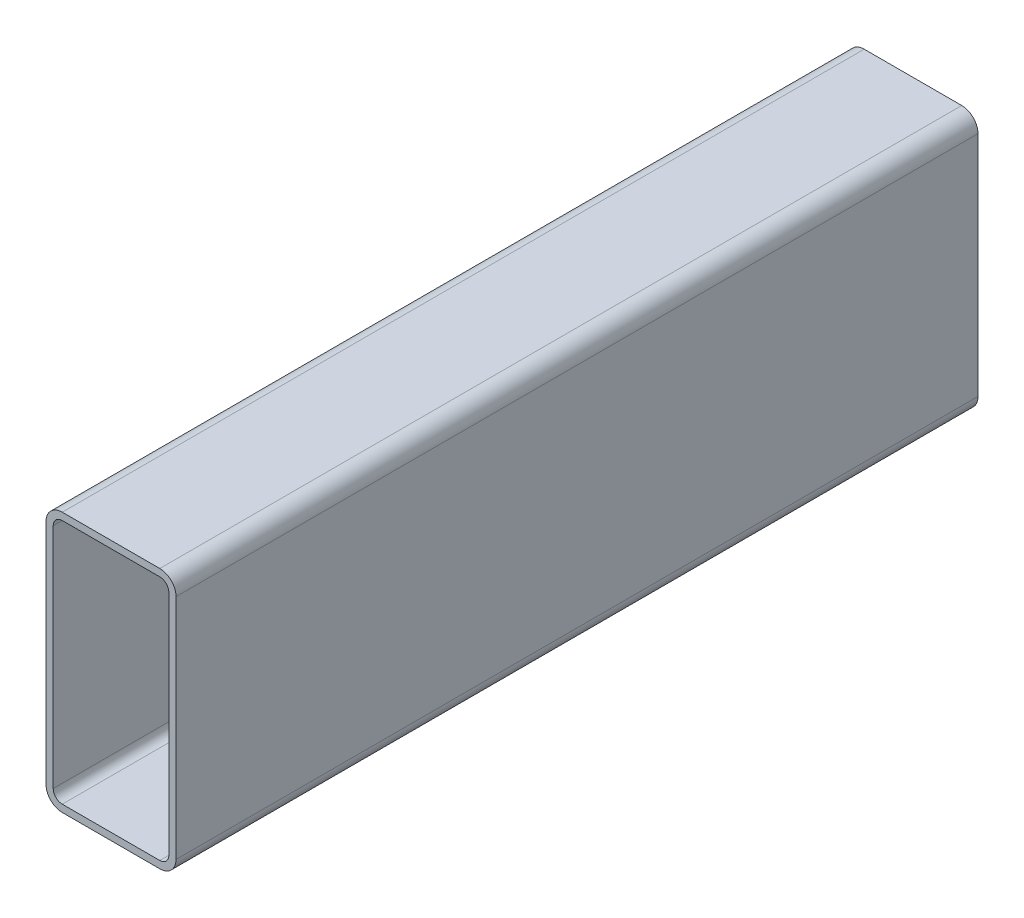
ISO-10303-21;
HEADER;
FILE_DESCRIPTION(('STEP AP214'),'2;1');
FILE_NAME('part.step','',(''),(''),'','','');
FILE_SCHEMA(('AUTOMOTIVE_DESIGN { 1 0 10303 214 1 1 1 1 }'));
ENDSEC;
DATA;
#1=APPLICATION_CONTEXT('core data for automotive mechanical design processes');
#2=APPLICATION_PROTOCOL_DEFINITION('international standard','automotive_design',2000,#1);
#3=PRODUCT_CONTEXT('',#1,'mechanical');
#4=PRODUCT('Part','Part','',(#3));
#5=PRODUCT_RELATED_PRODUCT_CATEGORY('part','',(#4));
#6=PRODUCT_DEFINITION_FORMATION('','',#4);
#7=PRODUCT_DEFINITION_CONTEXT('part definition',#1,'design');
#8=PRODUCT_DEFINITION('design','',#6,#7);
#9=PRODUCT_DEFINITION_SHAPE('','',#8);
#10=(LENGTH_UNIT() NAMED_UNIT(*) SI_UNIT(.MILLI.,.METRE.));
#11=(NAMED_UNIT(*) PLANE_ANGLE_UNIT() SI_UNIT($,.RADIAN.));
#12=(NAMED_UNIT(*) SI_UNIT($,.STERADIAN.) SOLID_ANGLE_UNIT());
#13=UNCERTAINTY_MEASURE_WITH_UNIT(LENGTH_MEASURE(1.E-05),#10,'distance_accuracy_value','');
#14=(GEOMETRIC_REPRESENTATION_CONTEXT(3) GLOBAL_UNCERTAINTY_ASSIGNED_CONTEXT((#13)) GLOBAL_UNIT_ASSIGNED_CONTEXT((#10,
#11,#12)) REPRESENTATION_CONTEXT('',''));
#15=CARTESIAN_POINT('',(0.,0.,0.));
#16=DIRECTION('',(0.,0.,1.));
#17=DIRECTION('',(1.,0.,0.));
#18=AXIS2_PLACEMENT_3D('',#15,#16,#17);
#19=CARTESIAN_POINT('',(14.2874999999999,33.3375,234.95));
#20=DIRECTION('',(0.,0.,-1.));
#21=DIRECTION('',(0.,1.,0.));
#22=AXIS2_PLACEMENT_3D('',#19,#20,#21);
#23=CYLINDRICAL_SURFACE('',#22,4.7625);
#24=CARTESIAN_POINT('',(14.2874999999999,33.3375,0.));
#25=DIRECTION('',(0.,0.,1.));
#26=DIRECTION('',(1.,0.,0.));
#27=AXIS2_PLACEMENT_3D('',#24,#25,#26);
#28=CIRCLE('',#27,4.7625);
#29=CARTESIAN_POINT('',(19.0499999999999,33.3375000000001,0.));
#30=VERTEX_POINT('',#29);
#31=CARTESIAN_POINT('',(14.2874999999999,38.1000000000001,0.));
#32=VERTEX_POINT('',#31);
#33=EDGE_CURVE('E235',#30,#32,#28,.T.);
#34=ORIENTED_EDGE('',*,*,#33,.T.);
#35=DIRECTION('',(0.,0.,-1.));
#36=VECTOR('',#35,1.);
#37=CARTESIAN_POINT('',(14.2874999999999,38.1,234.95));
#38=LINE('',#37,#36);
#39=CARTESIAN_POINT('',(14.2874999999999,38.1,234.95));
#40=VERTEX_POINT('',#39);
#41=EDGE_CURVE('E12',#40,#32,#38,.T.);
#42=ORIENTED_EDGE('',*,*,#41,.F.);
#43=CARTESIAN_POINT('',(14.2874999999999,33.3375,234.95));
#44=DIRECTION('',(0.,0.,1.));
#45=DIRECTION('',(1.,0.,0.));
#46=AXIS2_PLACEMENT_3D('',#43,#44,#45);
#47=CIRCLE('',#46,4.7625);
#48=CARTESIAN_POINT('',(19.0499999999999,33.3375,234.95));
#49=VERTEX_POINT('',#48);
#50=EDGE_CURVE('E313',#49,#40,#47,.T.);
#51=ORIENTED_EDGE('',*,*,#50,.F.);
#52=DIRECTION('',(0.,0.,-1.));
#53=VECTOR('',#52,1.);
#54=CARTESIAN_POINT('',(19.0499999999999,33.3375,234.95));
#55=LINE('',#54,#53);
#56=EDGE_CURVE('E250',#49,#30,#55,.T.);
#57=ORIENTED_EDGE('',*,*,#56,.T.);
#58=EDGE_LOOP('',(#34,#42,#51,#57));
#59=FACE_BOUND('',#58,.T.);
#60=ADVANCED_FACE('F63',(#59),#23,.T.);
#61=CARTESIAN_POINT('',(14.2874999999999,38.1,234.95));
#62=DIRECTION('',(0.,-1.,0.));
#63=DIRECTION('',(1.,0.,0.));
#64=AXIS2_PLACEMENT_3D('',#61,#62,#63);
#65=PLANE('',#64);
#66=DIRECTION('',(-1.,0.,0.));
#67=VECTOR('',#66,1.);
#68=CARTESIAN_POINT('',(14.2874999999999,38.1000000000001,0.));
#69=LINE('',#68,#67);
#70=CARTESIAN_POINT('',(-14.2875000000001,38.1,0.));
#71=VERTEX_POINT('',#70);
#72=EDGE_CURVE('E238',#32,#71,#69,.T.);
#73=ORIENTED_EDGE('',*,*,#72,.T.);
#74=DIRECTION('',(0.,0.,-1.));
#75=VECTOR('',#74,1.);
#76=CARTESIAN_POINT('',(-14.2875000000001,38.0999999999999,234.95));
#77=LINE('',#76,#75);
#78=CARTESIAN_POINT('',(-14.2875000000001,38.0999999999999,234.95));
#79=VERTEX_POINT('',#78);
#80=EDGE_CURVE('E73',#79,#71,#77,.T.);
#81=ORIENTED_EDGE('',*,*,#80,.F.);
#82=DIRECTION('',(-1.,0.,0.));
#83=VECTOR('',#82,1.);
#84=CARTESIAN_POINT('',(14.2874999999999,38.1,234.95));
#85=LINE('',#84,#83);
#86=EDGE_CURVE('E315',#40,#79,#85,.T.);
#87=ORIENTED_EDGE('',*,*,#86,.F.);
#88=ORIENTED_EDGE('',*,*,#41,.T.);
#89=EDGE_LOOP('',(#73,#81,#87,#88));
#90=FACE_BOUND('',#89,.T.);
#91=ADVANCED_FACE('F350',(#90),#65,.F.);
#92=CARTESIAN_POINT('',(-14.2875000000001,33.3374999999999,234.95));
#93=DIRECTION('',(0.,0.,-1.));
#94=DIRECTION('',(0.,1.,0.));
#95=AXIS2_PLACEMENT_3D('',#92,#93,#94);
#96=CYLINDRICAL_SURFACE('',#95,4.7625);
#97=CARTESIAN_POINT('',(-14.2875000000001,33.3374999999999,0.));
#98=DIRECTION('',(0.,0.,1.));
#99=DIRECTION('',(1.,0.,0.));
#100=AXIS2_PLACEMENT_3D('',#97,#98,#99);
#101=CIRCLE('',#100,4.7625);
#102=CARTESIAN_POINT('',(-19.0500000000001,33.3374999999999,0.));
#103=VERTEX_POINT('',#102);
#104=EDGE_CURVE('E240',#71,#103,#101,.T.);
#105=ORIENTED_EDGE('',*,*,#104,.T.);
#106=DIRECTION('',(0.,0.,-1.));
#107=VECTOR('',#106,1.);
#108=CARTESIAN_POINT('',(-19.0500000000001,33.3374999999999,234.95));
#109=LINE('',#108,#107);
#110=CARTESIAN_POINT('',(-19.0500000000001,33.3374999999999,234.95));
#111=VERTEX_POINT('',#110);
#112=EDGE_CURVE('E257',#111,#103,#109,.T.);
#113=ORIENTED_EDGE('',*,*,#112,.F.);
#114=CARTESIAN_POINT('',(-14.2875000000001,33.3374999999999,234.95));
#115=DIRECTION('',(0.,0.,1.));
#116=DIRECTION('',(1.,0.,0.));
#117=AXIS2_PLACEMENT_3D('',#114,#115,#116);
#118=CIRCLE('',#117,4.7625);
#119=EDGE_CURVE('E317',#79,#111,#118,.T.);
#120=ORIENTED_EDGE('',*,*,#119,.F.);
#121=ORIENTED_EDGE('',*,*,#80,.T.);
#122=EDGE_LOOP('',(#105,#113,#120,#121));
#123=FACE_BOUND('',#122,.T.);
#124=ADVANCED_FACE('F355',(#123),#96,.T.);
#125=CARTESIAN_POINT('',(-19.0499999999999,-33.3375000000001,234.95));
#126=DIRECTION('',(1.,0.,0.));
#127=DIRECTION('',(0.,1.,0.));
#128=AXIS2_PLACEMENT_3D('',#125,#126,#127);
#129=PLANE('',#128);
#130=DIRECTION('',(0.,-1.,0.));
#131=VECTOR('',#130,1.);
#132=CARTESIAN_POINT('',(-19.0499999999999,-33.3375000000001,0.));
#133=LINE('',#132,#131);
#134=CARTESIAN_POINT('',(-19.0499999999999,-33.3375000000001,0.));
#135=VERTEX_POINT('',#134);
#136=EDGE_CURVE('E242',#103,#135,#133,.T.);
#137=ORIENTED_EDGE('',*,*,#136,.T.);
#138=DIRECTION('',(0.,0.,-1.));
#139=VECTOR('',#138,1.);
#140=CARTESIAN_POINT('',(-19.0499999999999,-33.3375000000001,234.95));
#141=LINE('',#140,#139);
#142=CARTESIAN_POINT('',(-19.0499999999999,-33.3375000000001,234.95));
#143=VERTEX_POINT('',#142);
#144=EDGE_CURVE('E254',#143,#135,#141,.T.);
#145=ORIENTED_EDGE('',*,*,#144,.F.);
#146=DIRECTION('',(0.,-1.,0.));
#147=VECTOR('',#146,1.);
#148=CARTESIAN_POINT('',(-19.0499999999999,-33.3375000000001,234.95));
#149=LINE('',#148,#147);
#150=EDGE_CURVE('E319',#111,#143,#149,.T.);
#151=ORIENTED_EDGE('',*,*,#150,.F.);
#152=ORIENTED_EDGE('',*,*,#112,.T.);
#153=EDGE_LOOP('',(#137,#145,#151,#152));
#154=FACE_BOUND('',#153,.T.);
#155=ADVANCED_FACE('F325',(#154),#129,.F.);
#156=CARTESIAN_POINT('',(-14.2874999999999,-33.3375000000001,234.95));
#157=DIRECTION('',(0.,0.,-1.));
#158=DIRECTION('',(0.,1.,0.));
#159=AXIS2_PLACEMENT_3D('',#156,#157,#158);
#160=CYLINDRICAL_SURFACE('',#159,4.7625);
#161=CARTESIAN_POINT('',(-14.2874999999999,-33.3375,0.));
#162=DIRECTION('',(0.,0.,1.));
#163=DIRECTION('',(1.,0.,0.));
#164=AXIS2_PLACEMENT_3D('',#161,#162,#163);
#165=CIRCLE('',#164,4.7625);
#166=CARTESIAN_POINT('',(-14.2874999999999,-38.1000000000001,0.));
#167=VERTEX_POINT('',#166);
#168=EDGE_CURVE('E244',#135,#167,#165,.T.);
#169=ORIENTED_EDGE('',*,*,#168,.T.);
#170=DIRECTION('',(0.,0.,-1.));
#171=VECTOR('',#170,1.);
#172=CARTESIAN_POINT('',(-14.2874999999999,-38.1000000000001,234.95));
#173=LINE('',#172,#171);
#174=CARTESIAN_POINT('',(-14.2874999999999,-38.1000000000001,234.95));
#175=VERTEX_POINT('',#174);
#176=EDGE_CURVE('E202',#175,#167,#173,.T.);
#177=ORIENTED_EDGE('',*,*,#176,.F.);
#178=CARTESIAN_POINT('',(-14.2874999999999,-33.3375000000001,234.95));
#179=DIRECTION('',(0.,0.,1.));
#180=DIRECTION('',(1.,0.,0.));
#181=AXIS2_PLACEMENT_3D('',#178,#179,#180);
#182=CIRCLE('',#181,4.7625);
#183=EDGE_CURVE('E193',#143,#175,#182,.T.);
#184=ORIENTED_EDGE('',*,*,#183,.F.);
#185=ORIENTED_EDGE('',*,*,#144,.T.);
#186=EDGE_LOOP('',(#169,#177,#184,#185));
#187=FACE_BOUND('',#186,.T.);
#188=ADVANCED_FACE('F329',(#187),#160,.T.);
#189=CARTESIAN_POINT('',(-14.2874999999999,-38.1000000000001,234.95));
#190=DIRECTION('',(0.,1.,0.));
#191=DIRECTION('',(-1.,0.,0.));
#192=AXIS2_PLACEMENT_3D('',#189,#190,#191);
#193=PLANE('',#192);
#194=DIRECTION('',(1.,0.,0.));
#195=VECTOR('',#194,1.);
#196=CARTESIAN_POINT('',(-14.2874999999999,-38.1000000000001,0.));
#197=LINE('',#196,#195);
#198=CARTESIAN_POINT('',(14.2875000000001,-38.1,0.));
#199=VERTEX_POINT('',#198);
#200=EDGE_CURVE('E201',#167,#199,#197,.T.);
#201=ORIENTED_EDGE('',*,*,#200,.T.);
#202=DIRECTION('',(0.,0.,-1.));
#203=VECTOR('',#202,1.);
#204=CARTESIAN_POINT('',(14.2875000000001,-38.1,234.95));
#205=LINE('',#204,#203);
#206=CARTESIAN_POINT('',(14.2875000000001,-38.1,234.95));
#207=VERTEX_POINT('',#206);
#208=EDGE_CURVE('E198',#207,#199,#205,.T.);
#209=ORIENTED_EDGE('',*,*,#208,.F.);
#210=DIRECTION('',(1.,0.,0.));
#211=VECTOR('',#210,1.);
#212=CARTESIAN_POINT('',(-14.2874999999999,-38.1000000000001,234.95));
#213=LINE('',#212,#211);
#214=EDGE_CURVE('E187',#175,#207,#213,.T.);
#215=ORIENTED_EDGE('',*,*,#214,.F.);
#216=ORIENTED_EDGE('',*,*,#176,.T.);
#217=EDGE_LOOP('',(#201,#209,#215,#216));
#218=FACE_BOUND('',#217,.T.);
#219=ADVANCED_FACE('F199',(#218),#193,.F.);
#220=CARTESIAN_POINT('',(14.2875000000001,-33.3375,234.95));
#221=DIRECTION('',(0.,0.,-1.));
#222=DIRECTION('',(0.,1.,0.));
#223=AXIS2_PLACEMENT_3D('',#220,#221,#222);
#224=CYLINDRICAL_SURFACE('',#223,4.7625);
#225=CARTESIAN_POINT('',(14.2875000000001,-33.3374999999999,0.));
#226=DIRECTION('',(0.,0.,1.));
#227=DIRECTION('',(1.,0.,0.));
#228=AXIS2_PLACEMENT_3D('',#225,#226,#227);
#229=CIRCLE('',#228,4.7625);
#230=CARTESIAN_POINT('',(19.0500000000001,-33.3374999999999,0.));
#231=VERTEX_POINT('',#230);
#232=EDGE_CURVE('E135',#199,#231,#229,.T.);
#233=ORIENTED_EDGE('',*,*,#232,.T.);
#234=DIRECTION('',(0.,0.,-1.));
#235=VECTOR('',#234,1.);
#236=CARTESIAN_POINT('',(19.0500000000001,-33.3375,234.95));
#237=LINE('',#236,#235);
#238=CARTESIAN_POINT('',(19.0500000000001,-33.3375,234.95));
#239=VERTEX_POINT('',#238);
#240=EDGE_CURVE('E203',#239,#231,#237,.T.);
#241=ORIENTED_EDGE('',*,*,#240,.F.);
#242=CARTESIAN_POINT('',(14.2875000000001,-33.3375,234.95));
#243=DIRECTION('',(0.,0.,1.));
#244=DIRECTION('',(1.,0.,0.));
#245=AXIS2_PLACEMENT_3D('',#242,#243,#244);
#246=CIRCLE('',#245,4.7625);
#247=EDGE_CURVE('E191',#207,#239,#246,.T.);
#248=ORIENTED_EDGE('',*,*,#247,.F.);
#249=ORIENTED_EDGE('',*,*,#208,.T.);
#250=EDGE_LOOP('',(#233,#241,#248,#249));
#251=FACE_BOUND('',#250,.T.);
#252=ADVANCED_FACE('F205',(#251),#224,.T.);
#253=CARTESIAN_POINT('',(-14.2875000000001,33.3374999999999,234.95));
#254=DIRECTION('',(0.,0.,-1.));
#255=DIRECTION('',(0.,1.,0.));
#256=AXIS2_PLACEMENT_3D('',#253,#254,#255);
#257=CYLINDRICAL_SURFACE('',#256,2.64668);
#258=CARTESIAN_POINT('',(-14.2875000000001,33.3374999999999,0.));
#259=DIRECTION('',(0.,0.,1.));
#260=DIRECTION('',(1.,0.,0.));
#261=AXIS2_PLACEMENT_3D('',#258,#259,#260);
#262=CIRCLE('',#261,2.64668);
#263=CARTESIAN_POINT('',(-14.2875000000001,35.98418,0.));
#264=VERTEX_POINT('',#263);
#265=CARTESIAN_POINT('',(-16.9341800000001,33.3374999999999,0.));
#266=VERTEX_POINT('',#265);
#267=EDGE_CURVE('E211',#264,#266,#262,.T.);
#268=ORIENTED_EDGE('',*,*,#267,.F.);
#269=DIRECTION('',(0.,0.,-1.));
#270=VECTOR('',#269,1.);
#271=CARTESIAN_POINT('',(-14.2875000000001,35.9841799999999,234.95));
#272=LINE('',#271,#270);
#273=CARTESIAN_POINT('',(-14.2875000000001,35.9841799999999,234.95));
#274=VERTEX_POINT('',#273);
#275=EDGE_CURVE('E67',#274,#264,#272,.T.);
#276=ORIENTED_EDGE('',*,*,#275,.F.);
#277=CARTESIAN_POINT('',(-14.2875000000001,33.3374999999999,234.95));
#278=DIRECTION('',(0.,0.,1.));
#279=DIRECTION('',(1.,0.,0.));
#280=AXIS2_PLACEMENT_3D('',#277,#278,#279);
#281=CIRCLE('',#280,2.64668);
#282=CARTESIAN_POINT('',(-16.9341800000001,33.3374999999999,234.95));
#283=VERTEX_POINT('',#282);
#284=EDGE_CURVE('E249',#274,#283,#281,.T.);
#285=ORIENTED_EDGE('',*,*,#284,.T.);
#286=DIRECTION('',(0.,0.,-1.));
#287=VECTOR('',#286,1.);
#288=CARTESIAN_POINT('',(-16.9341800000001,33.3374999999999,234.95));
#289=LINE('',#288,#287);
#290=EDGE_CURVE('E207',#283,#266,#289,.T.);
#291=ORIENTED_EDGE('',*,*,#290,.T.);
#292=EDGE_LOOP('',(#268,#276,#285,#291));
#293=FACE_BOUND('',#292,.T.);
#294=ADVANCED_FACE('F65',(#293),#257,.F.);
#295=CARTESIAN_POINT('',(14.2874999999999,35.98418,234.95));
#296=DIRECTION('',(0.,-1.,0.));
#297=DIRECTION('',(1.,0.,0.));
#298=AXIS2_PLACEMENT_3D('',#295,#296,#297);
#299=PLANE('',#298);
#300=DIRECTION('',(-1.,0.,0.));
#301=VECTOR('',#300,1.);
#302=CARTESIAN_POINT('',(14.2874999999999,35.98418,0.));
#303=LINE('',#302,#301);
#304=CARTESIAN_POINT('',(14.2874999999999,35.98418,0.));
#305=VERTEX_POINT('',#304);
#306=EDGE_CURVE('E214',#305,#264,#303,.T.);
#307=ORIENTED_EDGE('',*,*,#306,.F.);
#308=DIRECTION('',(0.,0.,-1.));
#309=VECTOR('',#308,1.);
#310=CARTESIAN_POINT('',(14.2874999999999,35.98418,234.95));
#311=LINE('',#310,#309);
#312=CARTESIAN_POINT('',(14.2874999999999,35.98418,234.95));
#313=VERTEX_POINT('',#312);
#314=EDGE_CURVE('E272',#313,#305,#311,.T.);
#315=ORIENTED_EDGE('',*,*,#314,.F.);
#316=DIRECTION('',(-1.,0.,0.));
#317=VECTOR('',#316,1.);
#318=CARTESIAN_POINT('',(14.2874999999999,35.98418,234.95));
#319=LINE('',#318,#317);
#320=EDGE_CURVE('E281',#313,#274,#319,.T.);
#321=ORIENTED_EDGE('',*,*,#320,.T.);
#322=ORIENTED_EDGE('',*,*,#275,.T.);
#323=EDGE_LOOP('',(#307,#315,#321,#322));
#324=FACE_BOUND('',#323,.T.);
#325=ADVANCED_FACE('F279',(#324),#299,.T.);
#326=CARTESIAN_POINT('',(14.2874999999999,33.3375,234.95));
#327=DIRECTION('',(0.,0.,-1.));
#328=DIRECTION('',(0.,1.,0.));
#329=AXIS2_PLACEMENT_3D('',#326,#327,#328);
#330=CYLINDRICAL_SURFACE('',#329,2.64668);
#331=CARTESIAN_POINT('',(14.2874999999999,33.3375,0.));
#332=DIRECTION('',(0.,0.,1.));
#333=DIRECTION('',(1.,0.,0.));
#334=AXIS2_PLACEMENT_3D('',#331,#332,#333);
#335=CIRCLE('',#334,2.64668);
#336=CARTESIAN_POINT('',(16.9341799999999,33.3375000000001,0.));
#337=VERTEX_POINT('',#336);
#338=EDGE_CURVE('E217',#337,#305,#335,.T.);
#339=ORIENTED_EDGE('',*,*,#338,.F.);
#340=DIRECTION('',(0.,0.,-1.));
#341=VECTOR('',#340,1.);
#342=CARTESIAN_POINT('',(16.9341799999999,33.3375,234.95));
#343=LINE('',#342,#341);
#344=CARTESIAN_POINT('',(16.9341799999999,33.3375,234.95));
#345=VERTEX_POINT('',#344);
#346=EDGE_CURVE('E271',#345,#337,#343,.T.);
#347=ORIENTED_EDGE('',*,*,#346,.F.);
#348=CARTESIAN_POINT('',(14.2874999999999,33.3375,234.95));
#349=DIRECTION('',(0.,0.,1.));
#350=DIRECTION('',(1.,0.,0.));
#351=AXIS2_PLACEMENT_3D('',#348,#349,#350);
#352=CIRCLE('',#351,2.64668);
#353=EDGE_CURVE('E289',#345,#313,#352,.T.);
#354=ORIENTED_EDGE('',*,*,#353,.T.);
#355=ORIENTED_EDGE('',*,*,#314,.T.);
#356=EDGE_LOOP('',(#339,#347,#354,#355));
#357=FACE_BOUND('',#356,.T.);
#358=ADVANCED_FACE('F287',(#357),#330,.F.);
#359=CARTESIAN_POINT('',(16.9341799999999,33.3375,234.95));
#360=DIRECTION('',(-1.,0.,0.));
#361=DIRECTION('',(0.,-1.,0.));
#362=AXIS2_PLACEMENT_3D('',#359,#360,#361);
#363=PLANE('',#362);
#364=DIRECTION('',(0.,1.,0.));
#365=VECTOR('',#364,1.);
#366=CARTESIAN_POINT('',(16.9341799999999,33.3375000000001,0.));
#367=LINE('',#366,#365);
#368=CARTESIAN_POINT('',(16.9341800000001,-33.3374999999999,0.));
#369=VERTEX_POINT('',#368);
#370=EDGE_CURVE('E220',#369,#337,#367,.T.);
#371=ORIENTED_EDGE('',*,*,#370,.F.);
#372=DIRECTION('',(0.,0.,-1.));
#373=VECTOR('',#372,1.);
#374=CARTESIAN_POINT('',(16.9341800000001,-33.3375,234.95));
#375=LINE('',#374,#373);
#376=CARTESIAN_POINT('',(16.9341800000001,-33.3375,234.95));
#377=VERTEX_POINT('',#376);
#378=EDGE_CURVE('E269',#377,#369,#375,.T.);
#379=ORIENTED_EDGE('',*,*,#378,.F.);
#380=DIRECTION('',(0.,1.,0.));
#381=VECTOR('',#380,1.);
#382=CARTESIAN_POINT('',(16.9341799999999,33.3375,234.95));
#383=LINE('',#382,#381);
#384=EDGE_CURVE('E295',#377,#345,#383,.T.);
#385=ORIENTED_EDGE('',*,*,#384,.T.);
#386=ORIENTED_EDGE('',*,*,#346,.T.);
#387=EDGE_LOOP('',(#371,#379,#385,#386));
#388=FACE_BOUND('',#387,.T.);
#389=ADVANCED_FACE('F298',(#388),#363,.T.);
#390=CARTESIAN_POINT('',(14.2875000000001,-33.3375,234.95));
#391=DIRECTION('',(0.,0.,-1.));
#392=DIRECTION('',(0.,1.,0.));
#393=AXIS2_PLACEMENT_3D('',#390,#391,#392);
#394=CYLINDRICAL_SURFACE('',#393,2.64668);
#395=CARTESIAN_POINT('',(14.2875000000001,-33.3374999999999,0.));
#396=DIRECTION('',(0.,0.,1.));
#397=DIRECTION('',(1.,0.,0.));
#398=AXIS2_PLACEMENT_3D('',#395,#396,#397);
#399=CIRCLE('',#398,2.64668);
#400=CARTESIAN_POINT('',(14.2875000000001,-35.98418,0.));
#401=VERTEX_POINT('',#400);
#402=EDGE_CURVE('E223',#401,#369,#399,.T.);
#403=ORIENTED_EDGE('',*,*,#402,.F.);
#404=DIRECTION('',(0.,0.,-1.));
#405=VECTOR('',#404,1.);
#406=CARTESIAN_POINT('',(14.2875000000001,-35.98418,234.95));
#407=LINE('',#406,#405);
#408=CARTESIAN_POINT('',(14.2875000000001,-35.98418,234.95));
#409=VERTEX_POINT('',#408);
#410=EDGE_CURVE('E267',#409,#401,#407,.T.);
#411=ORIENTED_EDGE('',*,*,#410,.F.);
#412=CARTESIAN_POINT('',(14.2875000000001,-33.3375,234.95));
#413=DIRECTION('',(0.,0.,1.));
#414=DIRECTION('',(1.,0.,0.));
#415=AXIS2_PLACEMENT_3D('',#412,#413,#414);
#416=CIRCLE('',#415,2.64668);
#417=EDGE_CURVE('E299',#409,#377,#416,.T.);
#418=ORIENTED_EDGE('',*,*,#417,.T.);
#419=ORIENTED_EDGE('',*,*,#378,.T.);
#420=EDGE_LOOP('',(#403,#411,#418,#419));
#421=FACE_BOUND('',#420,.T.);
#422=ADVANCED_FACE('F366',(#421),#394,.F.);
#423=CARTESIAN_POINT('',(-14.2874999999999,-35.9841800000001,234.95));
#424=DIRECTION('',(0.,1.,0.));
#425=DIRECTION('',(-1.,0.,0.));
#426=AXIS2_PLACEMENT_3D('',#423,#424,#425);
#427=PLANE('',#426);
#428=DIRECTION('',(1.,0.,0.));
#429=VECTOR('',#428,1.);
#430=CARTESIAN_POINT('',(-14.2874999999999,-35.98418,0.));
#431=LINE('',#430,#429);
#432=CARTESIAN_POINT('',(-14.2874999999999,-35.98418,0.));
#433=VERTEX_POINT('',#432);
#434=EDGE_CURVE('E226',#433,#401,#431,.T.);
#435=ORIENTED_EDGE('',*,*,#434,.F.);
#436=DIRECTION('',(0.,0.,-1.));
#437=VECTOR('',#436,1.);
#438=CARTESIAN_POINT('',(-14.2874999999999,-35.9841800000001,234.95));
#439=LINE('',#438,#437);
#440=CARTESIAN_POINT('',(-14.2874999999999,-35.9841800000001,234.95));
#441=VERTEX_POINT('',#440);
#442=EDGE_CURVE('E265',#441,#433,#439,.T.);
#443=ORIENTED_EDGE('',*,*,#442,.F.);
#444=DIRECTION('',(1.,0.,0.));
#445=VECTOR('',#444,1.);
#446=CARTESIAN_POINT('',(-14.2874999999999,-35.9841800000001,234.95));
#447=LINE('',#446,#445);
#448=EDGE_CURVE('E301',#441,#409,#447,.T.);
#449=ORIENTED_EDGE('',*,*,#448,.T.);
#450=ORIENTED_EDGE('',*,*,#410,.T.);
#451=EDGE_LOOP('',(#435,#443,#449,#450));
#452=FACE_BOUND('',#451,.T.);
#453=ADVANCED_FACE('F362',(#452),#427,.T.);
#454=CARTESIAN_POINT('',(-14.2874999999999,-33.3375000000001,234.95));
#455=DIRECTION('',(0.,0.,-1.));
#456=DIRECTION('',(0.,1.,0.));
#457=AXIS2_PLACEMENT_3D('',#454,#455,#456);
#458=CYLINDRICAL_SURFACE('',#457,2.64668);
#459=CARTESIAN_POINT('',(-14.2874999999999,-33.3375,0.));
#460=DIRECTION('',(0.,0.,1.));
#461=DIRECTION('',(1.,0.,0.));
#462=AXIS2_PLACEMENT_3D('',#459,#460,#461);
#463=CIRCLE('',#462,2.64668);
#464=CARTESIAN_POINT('',(-16.9341799999999,-33.3375000000001,0.));
#465=VERTEX_POINT('',#464);
#466=EDGE_CURVE('E229',#465,#433,#463,.T.);
#467=ORIENTED_EDGE('',*,*,#466,.F.);
#468=DIRECTION('',(0.,0.,-1.));
#469=VECTOR('',#468,1.);
#470=CARTESIAN_POINT('',(-16.9341799999999,-33.3375000000001,234.95));
#471=LINE('',#470,#469);
#472=CARTESIAN_POINT('',(-16.9341799999999,-33.3375000000001,234.95));
#473=VERTEX_POINT('',#472);
#474=EDGE_CURVE('E263',#473,#465,#471,.T.);
#475=ORIENTED_EDGE('',*,*,#474,.F.);
#476=CARTESIAN_POINT('',(-14.2874999999999,-33.3375000000001,234.95));
#477=DIRECTION('',(0.,0.,1.));
#478=DIRECTION('',(1.,0.,0.));
#479=AXIS2_PLACEMENT_3D('',#476,#477,#478);
#480=CIRCLE('',#479,2.64668);
#481=EDGE_CURVE('E307',#473,#441,#480,.T.);
#482=ORIENTED_EDGE('',*,*,#481,.T.);
#483=ORIENTED_EDGE('',*,*,#442,.T.);
#484=EDGE_LOOP('',(#467,#475,#482,#483));
#485=FACE_BOUND('',#484,.T.);
#486=ADVANCED_FACE('F344',(#485),#458,.F.);
#487=CARTESIAN_POINT('',(-16.9341799999999,-33.3375000000001,234.95));
#488=DIRECTION('',(1.,0.,0.));
#489=DIRECTION('',(0.,1.,0.));
#490=AXIS2_PLACEMENT_3D('',#487,#488,#489);
#491=PLANE('',#490);
#492=DIRECTION('',(0.,-1.,0.));
#493=VECTOR('',#492,1.);
#494=CARTESIAN_POINT('',(-16.9341799999999,-33.3375000000001,0.));
#495=LINE('',#494,#493);
#496=EDGE_CURVE('E232',#266,#465,#495,.T.);
#497=ORIENTED_EDGE('',*,*,#496,.F.);
#498=ORIENTED_EDGE('',*,*,#290,.F.);
#499=DIRECTION('',(0.,-1.,0.));
#500=VECTOR('',#499,1.);
#501=CARTESIAN_POINT('',(-16.9341799999999,-33.3375000000001,234.95));
#502=LINE('',#501,#500);
#503=EDGE_CURVE('E310',#283,#473,#502,.T.);
#504=ORIENTED_EDGE('',*,*,#503,.T.);
#505=ORIENTED_EDGE('',*,*,#474,.T.);
#506=EDGE_LOOP('',(#497,#498,#504,#505));
#507=FACE_BOUND('',#506,.T.);
#508=ADVANCED_FACE('F337',(#507),#491,.T.);
#509=CARTESIAN_POINT('',(19.0499999999999,33.3375,234.95));
#510=DIRECTION('',(-1.,0.,0.));
#511=DIRECTION('',(0.,-1.,0.));
#512=AXIS2_PLACEMENT_3D('',#509,#510,#511);
#513=PLANE('',#512);
#514=DIRECTION('',(0.,1.,0.));
#515=VECTOR('',#514,1.);
#516=CARTESIAN_POINT('',(19.0499999999999,33.3375000000001,0.));
#517=LINE('',#516,#515);
#518=EDGE_CURVE('E141',#231,#30,#517,.T.);
#519=ORIENTED_EDGE('',*,*,#518,.T.);
#520=ORIENTED_EDGE('',*,*,#56,.F.);
#521=DIRECTION('',(0.,1.,0.));
#522=VECTOR('',#521,1.);
#523=CARTESIAN_POINT('',(19.0499999999999,33.3375,234.95));
#524=LINE('',#523,#522);
#525=EDGE_CURVE('E82',#239,#49,#524,.T.);
#526=ORIENTED_EDGE('',*,*,#525,.F.);
#527=ORIENTED_EDGE('',*,*,#240,.T.);
#528=EDGE_LOOP('',(#519,#520,#526,#527));
#529=FACE_BOUND('',#528,.T.);
#530=ADVANCED_FACE('F335',(#529),#513,.F.);
#531=CARTESIAN_POINT('',(14.2874999999999,33.3375,234.95));
#532=DIRECTION('',(0.,0.,1.));
#533=DIRECTION('',(1.,0.,0.));
#534=AXIS2_PLACEMENT_3D('',#531,#532,#533);
#535=PLANE('',#534);
#536=ORIENTED_EDGE('',*,*,#284,.F.);
#537=ORIENTED_EDGE('',*,*,#320,.F.);
#538=ORIENTED_EDGE('',*,*,#353,.F.);
#539=ORIENTED_EDGE('',*,*,#384,.F.);
#540=ORIENTED_EDGE('',*,*,#417,.F.);
#541=ORIENTED_EDGE('',*,*,#448,.F.);
#542=ORIENTED_EDGE('',*,*,#481,.F.);
#543=ORIENTED_EDGE('',*,*,#503,.F.);
#544=EDGE_LOOP('',(#536,#537,#538,#539,#540,#541,#542,#543));
#545=FACE_BOUND('',#544,.T.);
#546=ORIENTED_EDGE('',*,*,#50,.T.);
#547=ORIENTED_EDGE('',*,*,#86,.T.);
#548=ORIENTED_EDGE('',*,*,#119,.T.);
#549=ORIENTED_EDGE('',*,*,#150,.T.);
#550=ORIENTED_EDGE('',*,*,#183,.T.);
#551=ORIENTED_EDGE('',*,*,#214,.T.);
#552=ORIENTED_EDGE('',*,*,#247,.T.);
#553=ORIENTED_EDGE('',*,*,#525,.T.);
#554=EDGE_LOOP('',(#546,#547,#548,#549,#550,#551,#552,#553));
#555=FACE_BOUND('',#554,.T.);
#556=ADVANCED_FACE('F189',(#545,#555),#535,.T.);
#557=CARTESIAN_POINT('',(14.2874999999999,33.3375,0.));
#558=DIRECTION('',(0.,0.,1.));
#559=DIRECTION('',(1.,0.,0.));
#560=AXIS2_PLACEMENT_3D('',#557,#558,#559);
#561=PLANE('',#560);
#562=ORIENTED_EDGE('',*,*,#267,.T.);
#563=ORIENTED_EDGE('',*,*,#496,.T.);
#564=ORIENTED_EDGE('',*,*,#466,.T.);
#565=ORIENTED_EDGE('',*,*,#434,.T.);
#566=ORIENTED_EDGE('',*,*,#402,.T.);
#567=ORIENTED_EDGE('',*,*,#370,.T.);
#568=ORIENTED_EDGE('',*,*,#338,.T.);
#569=ORIENTED_EDGE('',*,*,#306,.T.);
#570=EDGE_LOOP('',(#562,#563,#564,#565,#566,#567,#568,#569));
#571=FACE_BOUND('',#570,.T.);
#572=ORIENTED_EDGE('',*,*,#33,.F.);
#573=ORIENTED_EDGE('',*,*,#518,.F.);
#574=ORIENTED_EDGE('',*,*,#232,.F.);
#575=ORIENTED_EDGE('',*,*,#200,.F.);
#576=ORIENTED_EDGE('',*,*,#168,.F.);
#577=ORIENTED_EDGE('',*,*,#136,.F.);
#578=ORIENTED_EDGE('',*,*,#104,.F.);
#579=ORIENTED_EDGE('',*,*,#72,.F.);
#580=EDGE_LOOP('',(#572,#573,#574,#575,#576,#577,#578,#579));
#581=FACE_BOUND('',#580,.T.);
#582=ADVANCED_FACE('F284',(#571,#581),#561,.F.);
#583=CLOSED_SHELL('',(#60,#91,#124,#155,#188,#219,#252,#294,#325,#358,#389,#422,#453,#486,#508,
#530,#556,#582));
#584=MANIFOLD_SOLID_BREP('B2',#583);
#585=ADVANCED_BREP_SHAPE_REPRESENTATION('',(#18,#584),#14);
#586=SHAPE_DEFINITION_REPRESENTATION(#9,#585);
ENDSEC;
END-ISO-10303-21;
